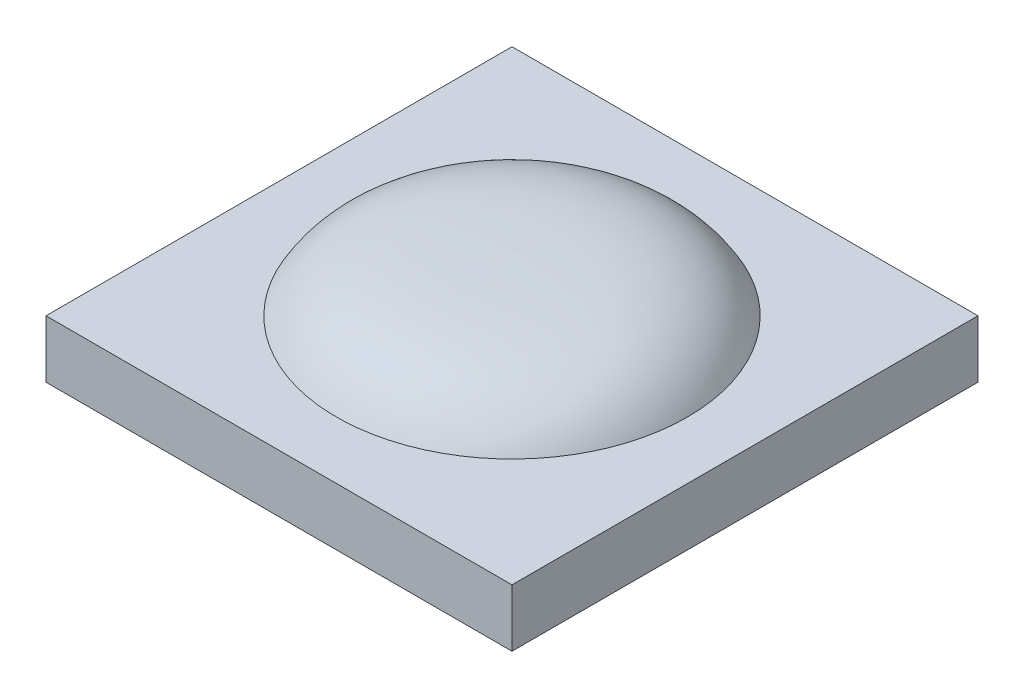
ISO-10303-21;
HEADER;
FILE_DESCRIPTION(('STEP AP214'),'2;1');
FILE_NAME('part.step','',(''),(''),'','','');
FILE_SCHEMA(('AUTOMOTIVE_DESIGN { 1 0 10303 214 1 1 1 1 }'));
ENDSEC;
DATA;
#1=APPLICATION_CONTEXT('core data for automotive mechanical design processes');
#2=APPLICATION_PROTOCOL_DEFINITION('international standard','automotive_design',2000,#1);
#3=PRODUCT_CONTEXT('',#1,'mechanical');
#4=PRODUCT('Part','Part','',(#3));
#5=PRODUCT_RELATED_PRODUCT_CATEGORY('part','',(#4));
#6=PRODUCT_DEFINITION_FORMATION('','',#4);
#7=PRODUCT_DEFINITION_CONTEXT('part definition',#1,'design');
#8=PRODUCT_DEFINITION('design','',#6,#7);
#9=PRODUCT_DEFINITION_SHAPE('','',#8);
#10=(LENGTH_UNIT() NAMED_UNIT(*) SI_UNIT(.MILLI.,.METRE.));
#11=(NAMED_UNIT(*) PLANE_ANGLE_UNIT() SI_UNIT($,.RADIAN.));
#12=(NAMED_UNIT(*) SI_UNIT($,.STERADIAN.) SOLID_ANGLE_UNIT());
#13=UNCERTAINTY_MEASURE_WITH_UNIT(LENGTH_MEASURE(1.E-05),#10,'distance_accuracy_value','');
#14=(GEOMETRIC_REPRESENTATION_CONTEXT(3) GLOBAL_UNCERTAINTY_ASSIGNED_CONTEXT((#13)) GLOBAL_UNIT_ASSIGNED_CONTEXT((#10,
#11,#12)) REPRESENTATION_CONTEXT('',''));
#15=CARTESIAN_POINT('',(0.,0.,0.));
#16=DIRECTION('',(0.,0.,1.));
#17=DIRECTION('',(1.,0.,0.));
#18=AXIS2_PLACEMENT_3D('',#15,#16,#17);
#19=CARTESIAN_POINT('',(0.,0.,0.));
#20=DIRECTION('',(0.,-1.,0.));
#21=DIRECTION('',(0.,0.,-1.));
#22=AXIS2_PLACEMENT_3D('',#19,#20,#21);
#23=PLANE('',#22);
#24=DIRECTION('',(0.,0.,-1.));
#25=VECTOR('',#24,1.);
#26=CARTESIAN_POINT('',(40.5,0.,40.5));
#27=LINE('',#26,#25);
#28=CARTESIAN_POINT('',(40.5,0.,40.5));
#29=VERTEX_POINT('',#28);
#30=CARTESIAN_POINT('',(40.5,0.,-40.5));
#31=VERTEX_POINT('',#30);
#32=EDGE_CURVE('E107',#29,#31,#27,.T.);
#33=ORIENTED_EDGE('',*,*,#32,.T.);
#34=DIRECTION('',(-1.,0.,0.));
#35=VECTOR('',#34,1.);
#36=CARTESIAN_POINT('',(-40.5,0.,-40.5));
#37=LINE('',#36,#35);
#38=CARTESIAN_POINT('',(-40.5,0.,-40.5));
#39=VERTEX_POINT('',#38);
#40=EDGE_CURVE('E110',#31,#39,#37,.T.);
#41=ORIENTED_EDGE('',*,*,#40,.T.);
#42=DIRECTION('',(0.,0.,1.));
#43=VECTOR('',#42,1.);
#44=CARTESIAN_POINT('',(-40.5,0.,40.5));
#45=LINE('',#44,#43);
#46=CARTESIAN_POINT('',(-40.5,0.,40.5));
#47=VERTEX_POINT('',#46);
#48=EDGE_CURVE('E91',#39,#47,#45,.T.);
#49=ORIENTED_EDGE('',*,*,#48,.T.);
#50=DIRECTION('',(1.,0.,0.));
#51=VECTOR('',#50,1.);
#52=CARTESIAN_POINT('',(-40.5,0.,40.5));
#53=LINE('',#52,#51);
#54=EDGE_CURVE('E103',#47,#29,#53,.T.);
#55=ORIENTED_EDGE('',*,*,#54,.T.);
#56=EDGE_LOOP('',(#33,#41,#49,#55));
#57=FACE_BOUND('',#56,.T.);
#58=CARTESIAN_POINT('',(0.,0.,0.));
#59=DIRECTION('',(0.,1.,0.));
#60=DIRECTION('',(-1.,0.,0.));
#61=AXIS2_PLACEMENT_3D('',#58,#59,#60);
#62=CIRCLE('',#61,30.5);
#63=CARTESIAN_POINT('',(-30.5,0.,0.));
#64=VERTEX_POINT('',#63);
#65=EDGE_CURVE('E11',#64,#64,#62,.F.);
#66=ORIENTED_EDGE('',*,*,#65,.T.);
#67=EDGE_LOOP('',(#66));
#68=FACE_BOUND('',#67,.T.);
#69=ADVANCED_FACE('F33',(#57,#68),#23,.F.);
#70=CARTESIAN_POINT('',(40.5,-10.,40.5));
#71=DIRECTION('',(1.,0.,0.));
#72=DIRECTION('',(0.,0.,-1.));
#73=AXIS2_PLACEMENT_3D('',#70,#71,#72);
#74=PLANE('',#73);
#75=ORIENTED_EDGE('',*,*,#32,.F.);
#76=DIRECTION('',(0.,1.,0.));
#77=VECTOR('',#76,1.);
#78=CARTESIAN_POINT('',(40.5,-10.,40.5));
#79=LINE('',#78,#77);
#80=CARTESIAN_POINT('',(40.5,-10.,40.5));
#81=VERTEX_POINT('',#80);
#82=EDGE_CURVE('E44',#81,#29,#79,.T.);
#83=ORIENTED_EDGE('',*,*,#82,.F.);
#84=DIRECTION('',(0.,0.,-1.));
#85=VECTOR('',#84,1.);
#86=CARTESIAN_POINT('',(40.5,-10.,40.5));
#87=LINE('',#86,#85);
#88=CARTESIAN_POINT('',(40.5,-10.,-40.5));
#89=VERTEX_POINT('',#88);
#90=EDGE_CURVE('E101',#81,#89,#87,.T.);
#91=ORIENTED_EDGE('',*,*,#90,.T.);
#92=DIRECTION('',(0.,1.,0.));
#93=VECTOR('',#92,1.);
#94=CARTESIAN_POINT('',(40.5,-10.,-40.5));
#95=LINE('',#94,#93);
#96=EDGE_CURVE('E79',#89,#31,#95,.T.);
#97=ORIENTED_EDGE('',*,*,#96,.T.);
#98=EDGE_LOOP('',(#75,#83,#91,#97));
#99=FACE_BOUND('',#98,.T.);
#100=ADVANCED_FACE('F117',(#99),#74,.T.);
#101=CARTESIAN_POINT('',(-40.5,-10.,40.5));
#102=DIRECTION('',(0.,0.,1.));
#103=DIRECTION('',(1.,0.,0.));
#104=AXIS2_PLACEMENT_3D('',#101,#102,#103);
#105=PLANE('',#104);
#106=ORIENTED_EDGE('',*,*,#54,.F.);
#107=DIRECTION('',(0.,1.,0.));
#108=VECTOR('',#107,1.);
#109=CARTESIAN_POINT('',(-40.5,-10.,40.5));
#110=LINE('',#109,#108);
#111=CARTESIAN_POINT('',(-40.5,-10.,40.5));
#112=VERTEX_POINT('',#111);
#113=EDGE_CURVE('E93',#112,#47,#110,.T.);
#114=ORIENTED_EDGE('',*,*,#113,.F.);
#115=DIRECTION('',(1.,0.,0.));
#116=VECTOR('',#115,1.);
#117=CARTESIAN_POINT('',(-40.5,-10.,40.5));
#118=LINE('',#117,#116);
#119=EDGE_CURVE('E98',#112,#81,#118,.T.);
#120=ORIENTED_EDGE('',*,*,#119,.T.);
#121=ORIENTED_EDGE('',*,*,#82,.T.);
#122=EDGE_LOOP('',(#106,#114,#120,#121));
#123=FACE_BOUND('',#122,.T.);
#124=ADVANCED_FACE('F120',(#123),#105,.T.);
#125=CARTESIAN_POINT('',(-40.5,-10.,40.5));
#126=DIRECTION('',(-1.,0.,0.));
#127=DIRECTION('',(0.,0.,1.));
#128=AXIS2_PLACEMENT_3D('',#125,#126,#127);
#129=PLANE('',#128);
#130=ORIENTED_EDGE('',*,*,#48,.F.);
#131=DIRECTION('',(0.,1.,0.));
#132=VECTOR('',#131,1.);
#133=CARTESIAN_POINT('',(-40.5,-10.,-40.5));
#134=LINE('',#133,#132);
#135=CARTESIAN_POINT('',(-40.5,-10.,-40.5));
#136=VERTEX_POINT('',#135);
#137=EDGE_CURVE('E85',#136,#39,#134,.T.);
#138=ORIENTED_EDGE('',*,*,#137,.F.);
#139=DIRECTION('',(0.,0.,1.));
#140=VECTOR('',#139,1.);
#141=CARTESIAN_POINT('',(-40.5,-10.,40.5));
#142=LINE('',#141,#140);
#143=EDGE_CURVE('E88',#136,#112,#142,.T.);
#144=ORIENTED_EDGE('',*,*,#143,.T.);
#145=ORIENTED_EDGE('',*,*,#113,.T.);
#146=EDGE_LOOP('',(#130,#138,#144,#145));
#147=FACE_BOUND('',#146,.T.);
#148=ADVANCED_FACE('F87',(#147),#129,.T.);
#149=CARTESIAN_POINT('',(-40.5,-10.,-40.5));
#150=DIRECTION('',(0.,0.,-1.));
#151=DIRECTION('',(-1.,0.,0.));
#152=AXIS2_PLACEMENT_3D('',#149,#150,#151);
#153=PLANE('',#152);
#154=ORIENTED_EDGE('',*,*,#40,.F.);
#155=ORIENTED_EDGE('',*,*,#96,.F.);
#156=DIRECTION('',(-1.,0.,0.));
#157=VECTOR('',#156,1.);
#158=CARTESIAN_POINT('',(-40.5,-10.,-40.5));
#159=LINE('',#158,#157);
#160=EDGE_CURVE('E97',#89,#136,#159,.T.);
#161=ORIENTED_EDGE('',*,*,#160,.T.);
#162=ORIENTED_EDGE('',*,*,#137,.T.);
#163=EDGE_LOOP('',(#154,#155,#161,#162));
#164=FACE_BOUND('',#163,.T.);
#165=ADVANCED_FACE('F100',(#164),#153,.T.);
#166=CARTESIAN_POINT('',(0.,-10.,0.));
#167=DIRECTION('',(0.,-1.,0.));
#168=DIRECTION('',(0.,0.,-1.));
#169=AXIS2_PLACEMENT_3D('',#166,#167,#168);
#170=PLANE('',#169);
#171=ORIENTED_EDGE('',*,*,#90,.F.);
#172=ORIENTED_EDGE('',*,*,#119,.F.);
#173=ORIENTED_EDGE('',*,*,#143,.F.);
#174=ORIENTED_EDGE('',*,*,#160,.F.);
#175=EDGE_LOOP('',(#171,#172,#173,#174));
#176=FACE_BOUND('',#175,.T.);
#177=ADVANCED_FACE('F96',(#176),#170,.T.);
#178=CARTESIAN_POINT('',(30.5,0.,0.));
#179=CARTESIAN_POINT('',(24.4624394265557,10.5880967466127,0.));
#180=CARTESIAN_POINT('',(11.1572008384121,9.49282522301715,0.));
#181=CARTESIAN_POINT('',(0.,10.,0.));
#182=B_SPLINE_CURVE_WITH_KNOTS('',3,(#178,#179,#180,#181),.UNSPECIFIED.,.F.,.F.,(4,4),(0.,1.),.UNSPECIFIED.);
#183=CARTESIAN_POINT('',(0.,10.,0.));
#184=DIRECTION('',(0.,1.,0.));
#185=AXIS1_PLACEMENT('',#183,#184);
#186=SURFACE_OF_REVOLUTION('',#182,#185);
#187=CARTESIAN_POINT('',(0.,10.,0.));
#188=VERTEX_POINT('',#187);
#189=VERTEX_LOOP('',#188);
#190=FACE_BOUND('',#189,.T.);
#191=ORIENTED_EDGE('',*,*,#65,.F.);
#192=EDGE_LOOP('',(#191));
#193=FACE_BOUND('',#192,.T.);
#194=ADVANCED_FACE('F35',(#190,#193),#186,.T.);
#195=CLOSED_SHELL('',(#69,#100,#124,#148,#165,#177,#194));
#196=MANIFOLD_SOLID_BREP('B2',#195);
#197=ADVANCED_BREP_SHAPE_REPRESENTATION('',(#18,#196),#14);
#198=SHAPE_DEFINITION_REPRESENTATION(#9,#197);
ENDSEC;
END-ISO-10303-21;
